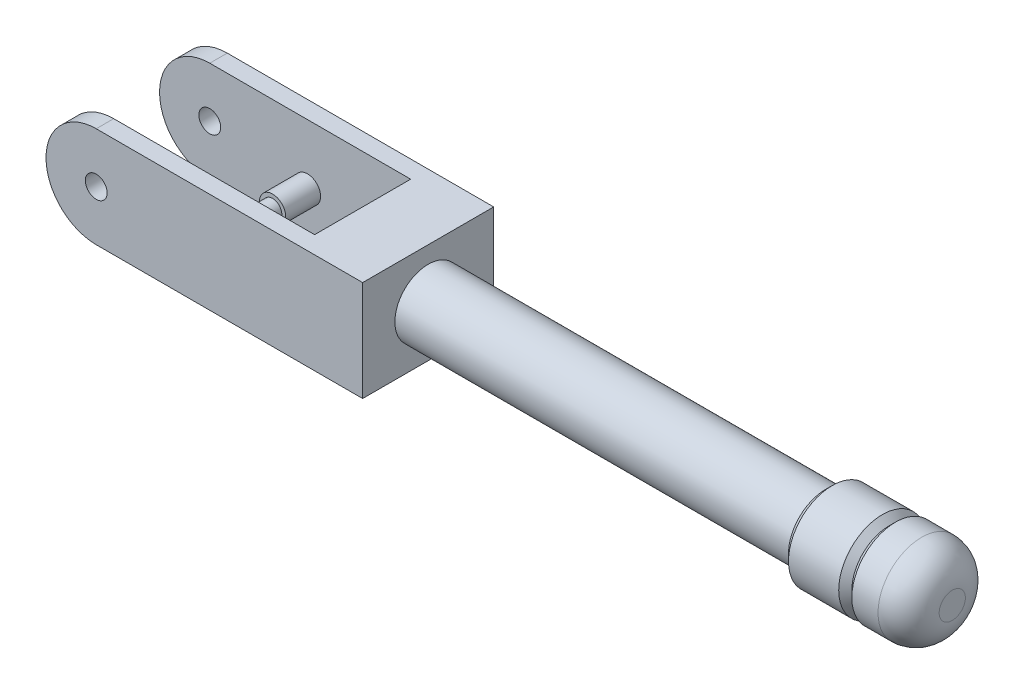
ISO-10303-21;
HEADER;
FILE_DESCRIPTION(('STEP AP214'),'2;1');
FILE_NAME('part.step','',(''),(''),'','','');
FILE_SCHEMA(('AUTOMOTIVE_DESIGN { 1 0 10303 214 1 1 1 1 }'));
ENDSEC;
DATA;
#1=APPLICATION_CONTEXT('core data for automotive mechanical design processes');
#2=APPLICATION_PROTOCOL_DEFINITION('international standard','automotive_design',2000,#1);
#3=PRODUCT_CONTEXT('',#1,'mechanical');
#4=PRODUCT('Part','Part','',(#3));
#5=PRODUCT_RELATED_PRODUCT_CATEGORY('part','',(#4));
#6=PRODUCT_DEFINITION_FORMATION('','',#4);
#7=PRODUCT_DEFINITION_CONTEXT('part definition',#1,'design');
#8=PRODUCT_DEFINITION('design','',#6,#7);
#9=PRODUCT_DEFINITION_SHAPE('','',#8);
#10=(LENGTH_UNIT() NAMED_UNIT(*) SI_UNIT(.MILLI.,.METRE.));
#11=(NAMED_UNIT(*) PLANE_ANGLE_UNIT() SI_UNIT($,.RADIAN.));
#12=(NAMED_UNIT(*) SI_UNIT($,.STERADIAN.) SOLID_ANGLE_UNIT());
#13=UNCERTAINTY_MEASURE_WITH_UNIT(LENGTH_MEASURE(1.E-05),#10,'distance_accuracy_value','');
#14=(GEOMETRIC_REPRESENTATION_CONTEXT(3) GLOBAL_UNCERTAINTY_ASSIGNED_CONTEXT((#13)) GLOBAL_UNIT_ASSIGNED_CONTEXT((#10,
#11,#12)) REPRESENTATION_CONTEXT('',''));
#15=CARTESIAN_POINT('',(0.,0.,0.));
#16=DIRECTION('',(0.,0.,1.));
#17=DIRECTION('',(1.,0.,0.));
#18=AXIS2_PLACEMENT_3D('',#15,#16,#17);
#19=CARTESIAN_POINT('',(122.000008821044,-23.,-30.));
#20=DIRECTION('',(1.,0.,0.));
#21=DIRECTION('',(0.,0.,-1.));
#22=AXIS2_PLACEMENT_3D('',#19,#20,#21);
#23=PLANE('',#22);
#24=DIRECTION('',(0.,1.,0.));
#25=VECTOR('',#24,1.);
#26=CARTESIAN_POINT('',(122.000008821044,-23.,30.));
#27=LINE('',#26,#25);
#28=CARTESIAN_POINT('',(122.000008821044,-23.,30.));
#29=VERTEX_POINT('',#28);
#30=CARTESIAN_POINT('',(122.000008821044,22.9999999999961,30.));
#31=VERTEX_POINT('',#30);
#32=EDGE_CURVE('E291',#29,#31,#27,.T.);
#33=ORIENTED_EDGE('',*,*,#32,.F.);
#34=DIRECTION('',(0.,0.,1.));
#35=VECTOR('',#34,1.);
#36=CARTESIAN_POINT('',(122.000008821044,-23.,-30.));
#37=LINE('',#36,#35);
#38=CARTESIAN_POINT('',(122.000008821044,-23.,-30.));
#39=VERTEX_POINT('',#38);
#40=EDGE_CURVE('E91',#39,#29,#37,.T.);
#41=ORIENTED_EDGE('',*,*,#40,.F.);
#42=DIRECTION('',(0.,1.,0.));
#43=VECTOR('',#42,1.);
#44=CARTESIAN_POINT('',(122.000008821044,-23.,-30.));
#45=LINE('',#44,#43);
#46=CARTESIAN_POINT('',(122.000008821044,22.9999999999961,-30.));
#47=VERTEX_POINT('',#46);
#48=EDGE_CURVE('E299',#39,#47,#45,.T.);
#49=ORIENTED_EDGE('',*,*,#48,.T.);
#50=DIRECTION('',(0.,0.,1.));
#51=VECTOR('',#50,1.);
#52=CARTESIAN_POINT('',(122.000008821044,22.9999999999961,-30.));
#53=LINE('',#52,#51);
#54=EDGE_CURVE('E141',#47,#31,#53,.T.);
#55=ORIENTED_EDGE('',*,*,#54,.T.);
#56=EDGE_LOOP('',(#33,#41,#49,#55));
#57=FACE_BOUND('',#56,.T.);
#58=CARTESIAN_POINT('',(122.000008821044,-1.9671764217577E-12,0.));
#59=DIRECTION('',(1.,0.,0.));
#60=DIRECTION('',(0.,0.,-1.));
#61=AXIS2_PLACEMENT_3D('',#58,#59,#60);
#62=CIRCLE('',#61,15.25);
#63=CARTESIAN_POINT('',(122.000008821044,-1.9671764217577E-12,-15.25));
#64=VERTEX_POINT('',#63);
#65=EDGE_CURVE('E327',#64,#64,#62,.T.);
#66=ORIENTED_EDGE('',*,*,#65,.F.);
#67=EDGE_LOOP('',(#66));
#68=FACE_BOUND('',#67,.T.);
#69=ADVANCED_FACE('F37',(#57,#68),#23,.T.);
#70=CARTESIAN_POINT('',(92.0000088210424,-23.0010000000037,22.));
#71=DIRECTION('',(0.,0.,1.));
#72=DIRECTION('',(1.,0.,0.));
#73=AXIS2_PLACEMENT_3D('',#70,#71,#72);
#74=PLANE('',#73);
#75=CARTESIAN_POINT('',(0.,0.,22.));
#76=DIRECTION('',(0.,0.,1.));
#77=DIRECTION('',(1.,0.,0.));
#78=AXIS2_PLACEMENT_3D('',#75,#76,#77);
#79=CIRCLE('',#78,5.);
#80=CARTESIAN_POINT('',(5.,0.,22.));
#81=VERTEX_POINT('',#80);
#82=EDGE_CURVE('E330',#81,#81,#79,.T.);
#83=ORIENTED_EDGE('',*,*,#82,.T.);
#84=EDGE_LOOP('',(#83));
#85=FACE_BOUND('',#84,.T.);
#86=CARTESIAN_POINT('',(0.,0.,22.));
#87=DIRECTION('',(0.,0.,1.));
#88=DIRECTION('',(1.,0.,0.));
#89=AXIS2_PLACEMENT_3D('',#86,#87,#88);
#90=CIRCLE('',#89,23.);
#91=CARTESIAN_POINT('',(7.49400541621981E-13,23.,22.));
#92=VERTEX_POINT('',#91);
#93=CARTESIAN_POINT('',(0.,-23.,22.));
#94=VERTEX_POINT('',#93);
#95=EDGE_CURVE('E130',#92,#94,#90,.T.);
#96=ORIENTED_EDGE('',*,*,#95,.F.);
#97=DIRECTION('',(1.,0.,0.));
#98=VECTOR('',#97,1.);
#99=CARTESIAN_POINT('',(92.0000088210439,22.999999999997,22.));
#100=LINE('',#99,#98);
#101=CARTESIAN_POINT('',(92.0000088210439,22.999999999997,22.));
#102=VERTEX_POINT('',#101);
#103=EDGE_CURVE('E123',#92,#102,#100,.T.);
#104=ORIENTED_EDGE('',*,*,#103,.T.);
#105=DIRECTION('',(0.,1.,0.));
#106=VECTOR('',#105,1.);
#107=CARTESIAN_POINT('',(92.0000088210424,-23.0010000000037,22.));
#108=LINE('',#107,#106);
#109=CARTESIAN_POINT('',(92.0000088210424,-23.,22.));
#110=VERTEX_POINT('',#109);
#111=EDGE_CURVE('E308',#110,#102,#108,.T.);
#112=ORIENTED_EDGE('',*,*,#111,.F.);
#113=DIRECTION('',(1.,0.,0.));
#114=VECTOR('',#113,1.);
#115=CARTESIAN_POINT('',(92.0000088210424,-23.,22.));
#116=LINE('',#115,#114);
#117=EDGE_CURVE('E285',#94,#110,#116,.T.);
#118=ORIENTED_EDGE('',*,*,#117,.F.);
#119=EDGE_LOOP('',(#96,#104,#112,#118));
#120=FACE_BOUND('',#119,.T.);
#121=CARTESIAN_POINT('',(44.7500088210439,-4.50000000000001,21.9999999999914));
#122=DIRECTION('',(0.,0.,1.));
#123=DIRECTION('',(1.,0.,0.));
#124=AXIS2_PLACEMENT_3D('',#121,#122,#123);
#125=CIRCLE('',#124,6.00000000000001);
#126=CARTESIAN_POINT('',(50.7500088210439,-4.50000000000001,21.9999999999914));
#127=VERTEX_POINT('',#126);
#128=EDGE_CURVE('E150',#127,#127,#125,.F.);
#129=ORIENTED_EDGE('',*,*,#128,.F.);
#130=EDGE_LOOP('',(#129));
#131=FACE_BOUND('',#130,.T.);
#132=ADVANCED_FACE('F186',(#85,#120,#131),#74,.F.);
#133=CARTESIAN_POINT('',(44.7500088210439,-4.50000000000001,-5.99999999999999));
#134=DIRECTION('',(0.,0.,1.));
#135=DIRECTION('',(1.,0.,0.));
#136=AXIS2_PLACEMENT_3D('',#133,#134,#135);
#137=PLANE('',#136);
#138=CARTESIAN_POINT('',(44.7500088210439,-4.50000000000001,-5.99999999999999));
#139=DIRECTION('',(0.,0.,1.));
#140=DIRECTION('',(1.,0.,0.));
#141=AXIS2_PLACEMENT_3D('',#138,#139,#140);
#142=CIRCLE('',#141,6.);
#143=CARTESIAN_POINT('',(50.7500088210439,-4.50000000000001,-5.99999999999999));
#144=VERTEX_POINT('',#143);
#145=EDGE_CURVE('E131',#144,#144,#142,.T.);
#146=ORIENTED_EDGE('',*,*,#145,.T.);
#147=EDGE_LOOP('',(#146));
#148=FACE_BOUND('',#147,.T.);
#149=CARTESIAN_POINT('',(44.7500088210439,-4.50000000000001,-5.99999999999999));
#150=DIRECTION('',(0.,0.,1.));
#151=DIRECTION('',(1.,0.,0.));
#152=AXIS2_PLACEMENT_3D('',#149,#150,#151);
#153=CIRCLE('',#152,4.25000000000001);
#154=CARTESIAN_POINT('',(49.0000088210439,-4.50000000000001,-5.99999999999999));
#155=VERTEX_POINT('',#154);
#156=EDGE_CURVE('E318',#155,#155,#153,.T.);
#157=ORIENTED_EDGE('',*,*,#156,.F.);
#158=EDGE_LOOP('',(#157));
#159=FACE_BOUND('',#158,.T.);
#160=ADVANCED_FACE('F191',(#148,#159),#137,.T.);
#161=CARTESIAN_POINT('',(92.0000088210424,-23.0010000000037,-22.));
#162=DIRECTION('',(0.,0.,-1.));
#163=DIRECTION('',(-1.,0.,0.));
#164=AXIS2_PLACEMENT_3D('',#161,#162,#163);
#165=PLANE('',#164);
#166=CARTESIAN_POINT('',(0.,0.,-22.));
#167=DIRECTION('',(0.,0.,-1.));
#168=DIRECTION('',(-1.,0.,0.));
#169=AXIS2_PLACEMENT_3D('',#166,#167,#168);
#170=CIRCLE('',#169,5.);
#171=CARTESIAN_POINT('',(-5.,0.,-22.));
#172=VERTEX_POINT('',#171);
#173=EDGE_CURVE('E335',#172,#172,#170,.T.);
#174=ORIENTED_EDGE('',*,*,#173,.T.);
#175=EDGE_LOOP('',(#174));
#176=FACE_BOUND('',#175,.T.);
#177=DIRECTION('',(0.,1.,0.));
#178=VECTOR('',#177,1.);
#179=CARTESIAN_POINT('',(92.0000088210424,-23.0010000000037,-22.));
#180=LINE('',#179,#178);
#181=CARTESIAN_POINT('',(92.0000088210439,-23.,-22.));
#182=VERTEX_POINT('',#181);
#183=CARTESIAN_POINT('',(92.0000088210439,22.999999999997,-22.));
#184=VERTEX_POINT('',#183);
#185=EDGE_CURVE('E120',#182,#184,#180,.T.);
#186=ORIENTED_EDGE('',*,*,#185,.T.);
#187=DIRECTION('',(-1.,0.,0.));
#188=VECTOR('',#187,1.);
#189=CARTESIAN_POINT('',(92.0000088210439,22.999999999997,-22.));
#190=LINE('',#189,#188);
#191=CARTESIAN_POINT('',(0.,23.,-22.));
#192=VERTEX_POINT('',#191);
#193=EDGE_CURVE('E115',#184,#192,#190,.T.);
#194=ORIENTED_EDGE('',*,*,#193,.T.);
#195=CARTESIAN_POINT('',(0.,0.,-22.));
#196=DIRECTION('',(0.,0.,-1.));
#197=DIRECTION('',(-1.,0.,0.));
#198=AXIS2_PLACEMENT_3D('',#195,#196,#197);
#199=CIRCLE('',#198,23.);
#200=CARTESIAN_POINT('',(0.,-23.,-22.));
#201=VERTEX_POINT('',#200);
#202=EDGE_CURVE('E119',#201,#192,#199,.T.);
#203=ORIENTED_EDGE('',*,*,#202,.F.);
#204=DIRECTION('',(-1.,0.,0.));
#205=VECTOR('',#204,1.);
#206=CARTESIAN_POINT('',(92.0000088210424,-23.,-22.));
#207=LINE('',#206,#205);
#208=EDGE_CURVE('E292',#182,#201,#207,.T.);
#209=ORIENTED_EDGE('',*,*,#208,.F.);
#210=EDGE_LOOP('',(#186,#194,#203,#209));
#211=FACE_BOUND('',#210,.T.);
#212=CARTESIAN_POINT('',(44.7500088210439,-4.50000000000001,-22.));
#213=DIRECTION('',(0.,0.,-1.));
#214=DIRECTION('',(-1.,0.,0.));
#215=AXIS2_PLACEMENT_3D('',#212,#213,#214);
#216=CIRCLE('',#215,6.);
#217=CARTESIAN_POINT('',(38.7500088210439,-4.50000000000001,-22.));
#218=VERTEX_POINT('',#217);
#219=EDGE_CURVE('E147',#218,#218,#216,.F.);
#220=ORIENTED_EDGE('',*,*,#219,.F.);
#221=EDGE_LOOP('',(#220));
#222=FACE_BOUND('',#221,.T.);
#223=ADVANCED_FACE('F117',(#176,#211,#222),#165,.F.);
#224=CARTESIAN_POINT('',(0.,0.,-30.));
#225=DIRECTION('',(0.,0.,1.));
#226=DIRECTION('',(1.,0.,0.));
#227=AXIS2_PLACEMENT_3D('',#224,#225,#226);
#228=CYLINDRICAL_SURFACE('',#227,23.);
#229=ORIENTED_EDGE('',*,*,#95,.T.);
#230=DIRECTION('',(0.,0.,1.));
#231=VECTOR('',#230,1.);
#232=CARTESIAN_POINT('',(0.,-23.,-30.));
#233=LINE('',#232,#231);
#234=CARTESIAN_POINT('',(0.,-23.,30.));
#235=VERTEX_POINT('',#234);
#236=EDGE_CURVE('E84',#94,#235,#233,.T.);
#237=ORIENTED_EDGE('',*,*,#236,.T.);
#238=CARTESIAN_POINT('',(0.,0.,30.));
#239=DIRECTION('',(0.,0.,1.));
#240=DIRECTION('',(1.,0.,0.));
#241=AXIS2_PLACEMENT_3D('',#238,#239,#240);
#242=CIRCLE('',#241,23.);
#243=CARTESIAN_POINT('',(0.,23.,30.));
#244=VERTEX_POINT('',#243);
#245=EDGE_CURVE('E295',#244,#235,#242,.T.);
#246=ORIENTED_EDGE('',*,*,#245,.F.);
#247=DIRECTION('',(0.,0.,1.));
#248=VECTOR('',#247,1.);
#249=CARTESIAN_POINT('',(0.,23.,-30.));
#250=LINE('',#249,#248);
#251=EDGE_CURVE('E138',#92,#244,#250,.T.);
#252=ORIENTED_EDGE('',*,*,#251,.F.);
#253=EDGE_LOOP('',(#229,#237,#246,#252));
#254=FACE_BOUND('',#253,.T.);
#255=ADVANCED_FACE('F201',(#254),#228,.T.);
#256=CARTESIAN_POINT('',(122.000008821044,-23.,-30.));
#257=DIRECTION('',(0.,-1.,0.));
#258=DIRECTION('',(0.,0.,-1.));
#259=AXIS2_PLACEMENT_3D('',#256,#257,#258);
#260=PLANE('',#259);
#261=ORIENTED_EDGE('',*,*,#117,.T.);
#262=DIRECTION('',(0.,0.,-1.));
#263=VECTOR('',#262,1.);
#264=CARTESIAN_POINT('',(92.0000088210424,-23.,-22.));
#265=LINE('',#264,#263);
#266=EDGE_CURVE('E281',#110,#182,#265,.T.);
#267=ORIENTED_EDGE('',*,*,#266,.T.);
#268=ORIENTED_EDGE('',*,*,#208,.T.);
#269=CARTESIAN_POINT('',(0.,-23.,-30.));
#270=VERTEX_POINT('',#269);
#271=EDGE_CURVE('E61',#270,#201,#233,.T.);
#272=ORIENTED_EDGE('',*,*,#271,.F.);
#273=DIRECTION('',(1.,0.,0.));
#274=VECTOR('',#273,1.);
#275=CARTESIAN_POINT('',(122.000008821044,-23.,-30.));
#276=LINE('',#275,#274);
#277=EDGE_CURVE('E298',#270,#39,#276,.T.);
#278=ORIENTED_EDGE('',*,*,#277,.T.);
#279=ORIENTED_EDGE('',*,*,#40,.T.);
#280=DIRECTION('',(1.,0.,0.));
#281=VECTOR('',#280,1.);
#282=CARTESIAN_POINT('',(122.000008821044,-23.,30.));
#283=LINE('',#282,#281);
#284=EDGE_CURVE('E287',#235,#29,#283,.T.);
#285=ORIENTED_EDGE('',*,*,#284,.F.);
#286=ORIENTED_EDGE('',*,*,#236,.F.);
#287=EDGE_LOOP('',(#261,#267,#268,#272,#278,#279,#285,#286));
#288=FACE_BOUND('',#287,.T.);
#289=ADVANCED_FACE('F198',(#288),#260,.T.);
#290=ORIENTED_EDGE('',*,*,#202,.T.);
#291=CARTESIAN_POINT('',(0.,23.,-30.));
#292=VERTEX_POINT('',#291);
#293=EDGE_CURVE('E128',#292,#192,#250,.T.);
#294=ORIENTED_EDGE('',*,*,#293,.F.);
#295=CARTESIAN_POINT('',(0.,0.,-30.));
#296=DIRECTION('',(0.,0.,1.));
#297=DIRECTION('',(1.,0.,0.));
#298=AXIS2_PLACEMENT_3D('',#295,#296,#297);
#299=CIRCLE('',#298,23.);
#300=EDGE_CURVE('E146',#292,#270,#299,.T.);
#301=ORIENTED_EDGE('',*,*,#300,.T.);
#302=ORIENTED_EDGE('',*,*,#271,.T.);
#303=EDGE_LOOP('',(#290,#294,#301,#302));
#304=FACE_BOUND('',#303,.T.);
#305=ADVANCED_FACE('F126',(#304),#228,.T.);
#306=CARTESIAN_POINT('',(0.,23.,-30.));
#307=DIRECTION('',(0.,1.,0.));
#308=DIRECTION('',(-1.,0.,0.));
#309=AXIS2_PLACEMENT_3D('',#306,#307,#308);
#310=PLANE('',#309);
#311=ORIENTED_EDGE('',*,*,#103,.F.);
#312=ORIENTED_EDGE('',*,*,#251,.T.);
#313=DIRECTION('',(-1.,0.,0.));
#314=VECTOR('',#313,1.);
#315=CARTESIAN_POINT('',(0.,23.,30.));
#316=LINE('',#315,#314);
#317=EDGE_CURVE('E297',#31,#244,#316,.T.);
#318=ORIENTED_EDGE('',*,*,#317,.F.);
#319=ORIENTED_EDGE('',*,*,#54,.F.);
#320=DIRECTION('',(-1.,0.,0.));
#321=VECTOR('',#320,1.);
#322=CARTESIAN_POINT('',(0.,23.,-30.));
#323=LINE('',#322,#321);
#324=EDGE_CURVE('E136',#47,#292,#323,.T.);
#325=ORIENTED_EDGE('',*,*,#324,.T.);
#326=ORIENTED_EDGE('',*,*,#293,.T.);
#327=ORIENTED_EDGE('',*,*,#193,.F.);
#328=DIRECTION('',(0.,0.,-1.));
#329=VECTOR('',#328,1.);
#330=CARTESIAN_POINT('',(92.0000088210439,22.999999999997,-22.));
#331=LINE('',#330,#329);
#332=EDGE_CURVE('E52',#102,#184,#331,.T.);
#333=ORIENTED_EDGE('',*,*,#332,.F.);
#334=EDGE_LOOP('',(#311,#312,#318,#319,#325,#326,#327,#333));
#335=FACE_BOUND('',#334,.T.);
#336=ADVANCED_FACE('F134',(#335),#310,.T.);
#337=CARTESIAN_POINT('',(0.,0.,-30.));
#338=DIRECTION('',(0.,0.,1.));
#339=DIRECTION('',(1.,0.,0.));
#340=AXIS2_PLACEMENT_3D('',#337,#338,#339);
#341=PLANE('',#340);
#342=CARTESIAN_POINT('',(0.,0.,-30.));
#343=DIRECTION('',(0.,0.,1.));
#344=DIRECTION('',(1.,0.,0.));
#345=AXIS2_PLACEMENT_3D('',#342,#343,#344);
#346=CIRCLE('',#345,5.);
#347=CARTESIAN_POINT('',(5.,0.,-30.));
#348=VERTEX_POINT('',#347);
#349=EDGE_CURVE('E338',#348,#348,#346,.T.);
#350=ORIENTED_EDGE('',*,*,#349,.T.);
#351=EDGE_LOOP('',(#350));
#352=FACE_BOUND('',#351,.T.);
#353=ORIENTED_EDGE('',*,*,#277,.F.);
#354=ORIENTED_EDGE('',*,*,#300,.F.);
#355=ORIENTED_EDGE('',*,*,#324,.F.);
#356=ORIENTED_EDGE('',*,*,#48,.F.);
#357=EDGE_LOOP('',(#353,#354,#355,#356));
#358=FACE_BOUND('',#357,.T.);
#359=ADVANCED_FACE('F265',(#352,#358),#341,.F.);
#360=CARTESIAN_POINT('',(0.,0.,30.));
#361=DIRECTION('',(0.,0.,1.));
#362=DIRECTION('',(1.,0.,0.));
#363=AXIS2_PLACEMENT_3D('',#360,#361,#362);
#364=PLANE('',#363);
#365=CARTESIAN_POINT('',(0.,0.,30.));
#366=DIRECTION('',(0.,0.,1.));
#367=DIRECTION('',(1.,0.,0.));
#368=AXIS2_PLACEMENT_3D('',#365,#366,#367);
#369=CIRCLE('',#368,5.);
#370=CARTESIAN_POINT('',(5.,0.,30.));
#371=VERTEX_POINT('',#370);
#372=EDGE_CURVE('E339',#371,#371,#369,.T.);
#373=ORIENTED_EDGE('',*,*,#372,.F.);
#374=EDGE_LOOP('',(#373));
#375=FACE_BOUND('',#374,.T.);
#376=ORIENTED_EDGE('',*,*,#284,.T.);
#377=ORIENTED_EDGE('',*,*,#32,.T.);
#378=ORIENTED_EDGE('',*,*,#317,.T.);
#379=ORIENTED_EDGE('',*,*,#245,.T.);
#380=EDGE_LOOP('',(#376,#377,#378,#379));
#381=FACE_BOUND('',#380,.T.);
#382=ADVANCED_FACE('F264',(#375,#381),#364,.T.);
#383=CARTESIAN_POINT('',(92.0000088210424,-23.0010000000037,-22.));
#384=DIRECTION('',(1.,0.,0.));
#385=DIRECTION('',(0.,1.,0.));
#386=AXIS2_PLACEMENT_3D('',#383,#384,#385);
#387=PLANE('',#386);
#388=ORIENTED_EDGE('',*,*,#111,.T.);
#389=ORIENTED_EDGE('',*,*,#332,.T.);
#390=ORIENTED_EDGE('',*,*,#185,.F.);
#391=ORIENTED_EDGE('',*,*,#266,.F.);
#392=EDGE_LOOP('',(#388,#389,#390,#391));
#393=FACE_BOUND('',#392,.T.);
#394=ADVANCED_FACE('F256',(#393),#387,.F.);
#395=CARTESIAN_POINT('',(44.7500088210439,-4.50000000000001,-5.99999999999999));
#396=DIRECTION('',(0.,0.,-1.));
#397=DIRECTION('',(-1.,0.,0.));
#398=AXIS2_PLACEMENT_3D('',#395,#396,#397);
#399=CYLINDRICAL_SURFACE('',#398,6.);
#400=ORIENTED_EDGE('',*,*,#145,.F.);
#401=EDGE_LOOP('',(#400));
#402=FACE_BOUND('',#401,.T.);
#403=ORIENTED_EDGE('',*,*,#219,.T.);
#404=EDGE_LOOP('',(#403));
#405=FACE_BOUND('',#404,.T.);
#406=ADVANCED_FACE('F250',(#402,#405),#399,.T.);
#407=CARTESIAN_POINT('',(44.7500088210439,-4.50000000000001,6.00000000000001));
#408=DIRECTION('',(0.,0.,-1.));
#409=DIRECTION('',(-1.,0.,0.));
#410=AXIS2_PLACEMENT_3D('',#407,#408,#409);
#411=CYLINDRICAL_SURFACE('',#410,4.25000000000001);
#412=CARTESIAN_POINT('',(44.7500088210439,-4.50000000000001,6.00000000000001));
#413=DIRECTION('',(0.,0.,1.));
#414=DIRECTION('',(1.,0.,0.));
#415=AXIS2_PLACEMENT_3D('',#412,#413,#414);
#416=CIRCLE('',#415,4.25000000000001);
#417=CARTESIAN_POINT('',(49.0000088210439,-4.50000000000001,6.00000000000001));
#418=VERTEX_POINT('',#417);
#419=EDGE_CURVE('E317',#418,#418,#416,.T.);
#420=ORIENTED_EDGE('',*,*,#419,.F.);
#421=EDGE_LOOP('',(#420));
#422=FACE_BOUND('',#421,.T.);
#423=ORIENTED_EDGE('',*,*,#156,.T.);
#424=EDGE_LOOP('',(#423));
#425=FACE_BOUND('',#424,.T.);
#426=ADVANCED_FACE('F243',(#422,#425),#411,.T.);
#427=CARTESIAN_POINT('',(44.7500088210439,-4.50000000000001,6.00000000000001));
#428=DIRECTION('',(0.,0.,1.));
#429=DIRECTION('',(1.,0.,0.));
#430=AXIS2_PLACEMENT_3D('',#427,#428,#429);
#431=PLANE('',#430);
#432=CARTESIAN_POINT('',(44.7500088210439,-4.50000000000001,6.00000000000001));
#433=DIRECTION('',(0.,0.,1.));
#434=DIRECTION('',(1.,0.,0.));
#435=AXIS2_PLACEMENT_3D('',#432,#433,#434);
#436=CIRCLE('',#435,6.00000000000001);
#437=CARTESIAN_POINT('',(50.7500088210439,-4.50000000000001,6.00000000000001));
#438=VERTEX_POINT('',#437);
#439=EDGE_CURVE('E321',#438,#438,#436,.T.);
#440=ORIENTED_EDGE('',*,*,#439,.F.);
#441=EDGE_LOOP('',(#440));
#442=FACE_BOUND('',#441,.T.);
#443=ORIENTED_EDGE('',*,*,#419,.T.);
#444=EDGE_LOOP('',(#443));
#445=FACE_BOUND('',#444,.T.);
#446=ADVANCED_FACE('F240',(#442,#445),#431,.F.);
#447=CARTESIAN_POINT('',(44.7500088210439,-4.50000000000001,500000.));
#448=DIRECTION('',(0.,0.,-1.));
#449=DIRECTION('',(-1.,0.,0.));
#450=AXIS2_PLACEMENT_3D('',#447,#448,#449);
#451=CYLINDRICAL_SURFACE('',#450,6.00000000000001);
#452=ORIENTED_EDGE('',*,*,#439,.T.);
#453=EDGE_LOOP('',(#452));
#454=FACE_BOUND('',#453,.T.);
#455=ORIENTED_EDGE('',*,*,#128,.T.);
#456=EDGE_LOOP('',(#455));
#457=FACE_BOUND('',#456,.T.);
#458=ADVANCED_FACE('F238',(#454,#457),#451,.T.);
#459=CARTESIAN_POINT('',(304.000008821044,-1.9671764217577E-12,0.));
#460=DIRECTION('',(-1.,0.,0.));
#461=DIRECTION('',(0.,0.,1.));
#462=AXIS2_PLACEMENT_3D('',#459,#460,#461);
#463=CYLINDRICAL_SURFACE('',#462,15.25);
#464=CARTESIAN_POINT('',(304.000008821044,-1.9671764217577E-12,0.));
#465=DIRECTION('',(1.,0.,0.));
#466=DIRECTION('',(0.,0.,-1.));
#467=AXIS2_PLACEMENT_3D('',#464,#465,#466);
#468=CIRCLE('',#467,15.25);
#469=CARTESIAN_POINT('',(304.000008821044,-1.9671764217577E-12,-15.25));
#470=VERTEX_POINT('',#469);
#471=EDGE_CURVE('E326',#470,#470,#468,.T.);
#472=ORIENTED_EDGE('',*,*,#471,.F.);
#473=EDGE_LOOP('',(#472));
#474=FACE_BOUND('',#473,.T.);
#475=ORIENTED_EDGE('',*,*,#65,.T.);
#476=EDGE_LOOP('',(#475));
#477=FACE_BOUND('',#476,.T.);
#478=ADVANCED_FACE('F232',(#474,#477),#463,.T.);
#479=CARTESIAN_POINT('',(304.000008821044,-1.9671764217577E-12,0.));
#480=DIRECTION('',(1.,0.,0.));
#481=DIRECTION('',(0.,0.,-1.));
#482=AXIS2_PLACEMENT_3D('',#479,#480,#481);
#483=PLANE('',#482);
#484=CARTESIAN_POINT('',(304.000008821044,-1.9671764217577E-12,0.));
#485=DIRECTION('',(1.,0.,0.));
#486=DIRECTION('',(0.,0.,-1.));
#487=AXIS2_PLACEMENT_3D('',#484,#485,#486);
#488=CIRCLE('',#487,16.9999999999998);
#489=CARTESIAN_POINT('',(304.000008821044,-1.9671764217577E-12,-16.9999999999998));
#490=VERTEX_POINT('',#489);
#491=EDGE_CURVE('E156',#490,#490,#488,.F.);
#492=ORIENTED_EDGE('',*,*,#491,.T.);
#493=EDGE_LOOP('',(#492));
#494=FACE_BOUND('',#493,.T.);
#495=ORIENTED_EDGE('',*,*,#471,.T.);
#496=EDGE_LOOP('',(#495));
#497=FACE_BOUND('',#496,.T.);
#498=ADVANCED_FACE('F225',(#494,#497),#483,.F.);
#499=CARTESIAN_POINT('',(333.000008821044,-1.9671764217577E-12,0.));
#500=DIRECTION('',(-1.,0.,0.));
#501=DIRECTION('',(0.,0.,1.));
#502=AXIS2_PLACEMENT_3D('',#499,#500,#501);
#503=CYLINDRICAL_SURFACE('',#502,20.);
#504=CARTESIAN_POINT('',(330.000008821044,-1.9671764217577E-12,0.));
#505=DIRECTION('',(1.,0.,0.));
#506=DIRECTION('',(0.,0.,-1.));
#507=AXIS2_PLACEMENT_3D('',#504,#505,#506);
#508=CIRCLE('',#507,20.);
#509=CARTESIAN_POINT('',(330.000008821044,-1.9671764217577E-12,20.));
#510=VERTEX_POINT('',#509);
#511=EDGE_CURVE('E162',#510,#510,#508,.F.);
#512=CARTESIAN_POINT('',(307.000008821044,-1.9671764217577E-12,0.));
#513=DIRECTION('',(1.,0.,0.));
#514=DIRECTION('',(0.,0.,-1.));
#515=AXIS2_PLACEMENT_3D('',#512,#513,#514);
#516=CIRCLE('',#515,20.);
#517=CARTESIAN_POINT('',(307.000008821044,-1.9671764217577E-12,20.));
#518=VERTEX_POINT('',#517);
#519=EDGE_CURVE('E153',#518,#518,#516,.T.);
#520=CARTESIAN_POINT('',(330.000008821044,-1.9671764217577E-12,20.));
#521=CARTESIAN_POINT('',(329.760425487711,-1.9671764217577E-12,20.));
#522=CARTESIAN_POINT('',(329.520842154377,-1.9671764217577E-12,20.));
#523=CARTESIAN_POINT('',(329.041675487711,-1.9671764217577E-12,20.));
#524=CARTESIAN_POINT('',(328.802092154377,-1.9671764217577E-12,20.));
#525=CARTESIAN_POINT('',(328.322925487711,-1.9671764217577E-12,20.));
#526=CARTESIAN_POINT('',(328.083342154377,-1.9671764217577E-12,20.));
#527=CARTESIAN_POINT('',(327.604175487711,-1.9671764217577E-12,20.));
#528=CARTESIAN_POINT('',(327.364592154377,-1.9671764217577E-12,20.));
#529=CARTESIAN_POINT('',(326.885425487711,-1.9671764217577E-12,20.));
#530=CARTESIAN_POINT('',(326.645842154377,-1.9671764217577E-12,20.));
#531=CARTESIAN_POINT('',(326.166675487711,-1.9671764217577E-12,20.));
#532=CARTESIAN_POINT('',(325.927092154377,-1.9671764217577E-12,20.));
#533=CARTESIAN_POINT('',(325.447925487711,-1.9671764217577E-12,20.));
#534=CARTESIAN_POINT('',(325.208342154377,-1.9671764217577E-12,20.));
#535=CARTESIAN_POINT('',(324.729175487711,-1.9671764217577E-12,20.));
#536=CARTESIAN_POINT('',(324.489592154377,-1.9671764217577E-12,20.));
#537=CARTESIAN_POINT('',(324.010425487711,-1.9671764217577E-12,20.));
#538=CARTESIAN_POINT('',(323.770842154377,-1.9671764217577E-12,20.));
#539=CARTESIAN_POINT('',(323.291675487711,-1.9671764217577E-12,20.));
#540=CARTESIAN_POINT('',(323.052092154377,-1.9671764217577E-12,20.));
#541=CARTESIAN_POINT('',(322.572925487711,-1.9671764217577E-12,20.));
#542=CARTESIAN_POINT('',(322.333342154377,-1.9671764217577E-12,20.));
#543=CARTESIAN_POINT('',(321.854175487711,-1.9671764217577E-12,20.));
#544=CARTESIAN_POINT('',(321.614592154377,-1.9671764217577E-12,20.));
#545=CARTESIAN_POINT('',(321.135425487711,-1.9671764217577E-12,20.));
#546=CARTESIAN_POINT('',(320.895842154377,-1.9671764217577E-12,20.));
#547=CARTESIAN_POINT('',(320.416675487711,-1.9671764217577E-12,20.));
#548=CARTESIAN_POINT('',(320.177092154377,-1.9671764217577E-12,20.));
#549=CARTESIAN_POINT('',(319.697925487711,-1.9671764217577E-12,20.));
#550=CARTESIAN_POINT('',(319.458342154377,-1.9671764217577E-12,20.));
#551=CARTESIAN_POINT('',(318.979175487711,-1.9671764217577E-12,20.));
#552=CARTESIAN_POINT('',(318.739592154377,-1.9671764217577E-12,20.));
#553=CARTESIAN_POINT('',(318.260425487711,-1.9671764217577E-12,20.));
#554=CARTESIAN_POINT('',(318.020842154377,-1.9671764217577E-12,20.));
#555=CARTESIAN_POINT('',(317.541675487711,-1.9671764217577E-12,20.));
#556=CARTESIAN_POINT('',(317.302092154377,-1.9671764217577E-12,20.));
#557=CARTESIAN_POINT('',(316.822925487711,-1.9671764217577E-12,20.));
#558=CARTESIAN_POINT('',(316.583342154377,-1.9671764217577E-12,20.));
#559=CARTESIAN_POINT('',(316.104175487711,-1.9671764217577E-12,20.));
#560=CARTESIAN_POINT('',(315.864592154377,-1.9671764217577E-12,20.));
#561=CARTESIAN_POINT('',(315.385425487711,-1.9671764217577E-12,20.));
#562=CARTESIAN_POINT('',(315.145842154377,-1.9671764217577E-12,20.));
#563=CARTESIAN_POINT('',(314.666675487711,-1.9671764217577E-12,20.));
#564=CARTESIAN_POINT('',(314.427092154377,-1.9671764217577E-12,20.));
#565=CARTESIAN_POINT('',(313.947925487711,-1.9671764217577E-12,20.));
#566=CARTESIAN_POINT('',(313.708342154377,-1.9671764217577E-12,20.));
#567=CARTESIAN_POINT('',(313.229175487711,-1.9671764217577E-12,20.));
#568=CARTESIAN_POINT('',(312.989592154377,-1.9671764217577E-12,20.));
#569=CARTESIAN_POINT('',(312.510425487711,-1.9671764217577E-12,20.));
#570=CARTESIAN_POINT('',(312.270842154377,-1.9671764217577E-12,20.));
#571=CARTESIAN_POINT('',(311.791675487711,-1.9671764217577E-12,20.));
#572=CARTESIAN_POINT('',(311.552092154377,-1.9671764217577E-12,20.));
#573=CARTESIAN_POINT('',(311.072925487711,-1.9671764217577E-12,20.));
#574=CARTESIAN_POINT('',(310.833342154377,-1.9671764217577E-12,20.));
#575=CARTESIAN_POINT('',(310.354175487711,-1.9671764217577E-12,20.));
#576=CARTESIAN_POINT('',(310.114592154377,-1.9671764217577E-12,20.));
#577=CARTESIAN_POINT('',(309.635425487711,-1.9671764217577E-12,20.));
#578=CARTESIAN_POINT('',(309.395842154377,-1.9671764217577E-12,20.));
#579=CARTESIAN_POINT('',(308.916675487711,-1.9671764217577E-12,20.));
#580=CARTESIAN_POINT('',(308.677092154377,-1.9671764217577E-12,20.));
#581=CARTESIAN_POINT('',(308.197925487711,-1.9671764217577E-12,20.));
#582=CARTESIAN_POINT('',(307.958342154377,-1.9671764217577E-12,20.));
#583=CARTESIAN_POINT('',(307.479175487711,-1.9671764217577E-12,20.));
#584=CARTESIAN_POINT('',(307.239592154377,-1.9671764217577E-12,20.));
#585=CARTESIAN_POINT('',(307.000008821044,-1.9671764217577E-12,20.));
#586=B_SPLINE_CURVE_WITH_KNOTS('',3,(#520,#521,#522,#523,#524,#525,#526,#527,#528,#529,#530,
#531,#532,#533,#534,#535,#536,#537,#538,#539,#540,#541,#542,#543,#544,#545,#546,#547,#548,#549,
#550,#551,#552,#553,#554,#555,#556,#557,#558,#559,#560,#561,#562,#563,#564,#565,#566,#567,#568,
#569,#570,#571,#572,#573,#574,#575,#576,#577,#578,#579,#580,#581,#582,#583,#584,#585),
.UNSPECIFIED.,.F.,.F.,(4,2,2,2,2,2,2,2,2,2,2,2,2,2,2,2,2,2,2,2,2,2,2,2,2,2,2,2,2,2,2,2,4),(0.,
0.71874999999999,1.43749999999998,2.15624999999997,2.87499999999996,3.59374999999995,
4.31249999999994,5.03124999999999,5.74999999999998,6.46874999999997,7.18749999999996,
7.90624999999995,8.62499999999994,9.34374999999998,10.0625,10.78125,11.5,12.2187499999999,
12.9374999999999,13.6562499999999,14.375,15.09375,15.8125,16.5312499999999,17.2499999999999,
17.9687499999999,18.6874999999999,19.40625,20.125,20.8437499999999,21.5624999999999,
22.2812499999999,22.9999999999999),.UNSPECIFIED.);
#587=EDGE_CURVE('BSEAM206',#510,#518,#586,.T.);
#588=ORIENTED_EDGE('',*,*,#511,.T.);
#589=ORIENTED_EDGE('',*,*,#519,.T.);
#590=ORIENTED_EDGE('',*,*,#587,.T.);
#591=ORIENTED_EDGE('',*,*,#587,.F.);
#592=EDGE_LOOP('',(#588,#590,#589,#591));
#593=FACE_BOUND('',#592,.T.);
#594=ADVANCED_FACE('F206',(#593),#503,.T.);
#595=CARTESIAN_POINT('',(307.000008821044,-1.9671764217577E-12,0.));
#596=DIRECTION('',(1.,0.,0.));
#597=DIRECTION('',(0.,0.,-1.));
#598=AXIS2_PLACEMENT_3D('',#595,#596,#597);
#599=CONICAL_SURFACE('',#598,20.,0.785398163397441);
#600=ORIENTED_EDGE('',*,*,#491,.F.);
#601=EDGE_LOOP('',(#600));
#602=FACE_BOUND('',#601,.T.);
#603=ORIENTED_EDGE('',*,*,#519,.F.);
#604=EDGE_LOOP('',(#603));
#605=FACE_BOUND('',#604,.T.);
#606=ADVANCED_FACE('F202',(#602,#605),#599,.T.);
#607=CARTESIAN_POINT('',(333.000008821044,-1.9671764217577E-12,0.));
#608=DIRECTION('',(-1.,0.,0.));
#609=DIRECTION('',(0.,0.,1.));
#610=AXIS2_PLACEMENT_3D('',#607,#608,#609);
#611=CONICAL_SURFACE('',#610,17.0000000000002,0.785398163397446);
#612=ORIENTED_EDGE('',*,*,#511,.F.);
#613=EDGE_LOOP('',(#612));
#614=FACE_BOUND('',#613,.T.);
#615=CARTESIAN_POINT('',(333.000008821044,-1.9671764217577E-12,0.));
#616=DIRECTION('',(1.,0.,0.));
#617=DIRECTION('',(0.,0.,-1.));
#618=AXIS2_PLACEMENT_3D('',#615,#616,#617);
#619=CIRCLE('',#618,17.0000000000002);
#620=CARTESIAN_POINT('',(333.000008821044,-1.9671764217577E-12,-17.0000000000002));
#621=VERTEX_POINT('',#620);
#622=EDGE_CURVE('E159',#621,#621,#619,.T.);
#623=ORIENTED_EDGE('',*,*,#622,.F.);
#624=EDGE_LOOP('',(#623));
#625=FACE_BOUND('',#624,.T.);
#626=ADVANCED_FACE('F205',(#614,#625),#611,.T.);
#627=CARTESIAN_POINT('',(362.000008821044,-1.9671764217577E-12,0.));
#628=DIRECTION('',(-1.,0.,0.));
#629=DIRECTION('',(0.,0.,1.));
#630=AXIS2_PLACEMENT_3D('',#627,#628,#629);
#631=CYLINDRICAL_SURFACE('',#630,20.);
#632=CARTESIAN_POINT('',(348.000008821044,-1.9671764217577E-12,0.));
#633=DIRECTION('',(1.,0.,0.));
#634=DIRECTION('',(0.,0.,-1.));
#635=AXIS2_PLACEMENT_3D('',#632,#633,#634);
#636=CIRCLE('',#635,20.);
#637=CARTESIAN_POINT('',(348.000008821044,-1.9671764217577E-12,20.));
#638=VERTEX_POINT('',#637);
#639=EDGE_CURVE('E11',#638,#638,#636,.F.);
#640=CARTESIAN_POINT('',(336.000008821044,-1.9671764217577E-12,0.));
#641=DIRECTION('',(1.,0.,0.));
#642=DIRECTION('',(0.,0.,-1.));
#643=AXIS2_PLACEMENT_3D('',#640,#641,#642);
#644=CIRCLE('',#643,20.);
#645=CARTESIAN_POINT('',(336.000008821044,-1.9671764217577E-12,20.));
#646=VERTEX_POINT('',#645);
#647=EDGE_CURVE('E165',#646,#646,#644,.T.);
#648=CARTESIAN_POINT('',(348.000008821044,-1.9671764217577E-12,20.));
#649=CARTESIAN_POINT('',(347.875008821044,-1.9671764217577E-12,20.));
#650=CARTESIAN_POINT('',(347.750008821044,-1.9671764217577E-12,20.));
#651=CARTESIAN_POINT('',(347.500008821044,-1.9671764217577E-12,20.));
#652=CARTESIAN_POINT('',(347.375008821044,-1.9671764217577E-12,20.));
#653=CARTESIAN_POINT('',(347.125008821044,-1.9671764217577E-12,20.));
#654=CARTESIAN_POINT('',(347.000008821044,-1.9671764217577E-12,20.));
#655=CARTESIAN_POINT('',(346.750008821044,-1.9671764217577E-12,20.));
#656=CARTESIAN_POINT('',(346.625008821044,-1.9671764217577E-12,20.));
#657=CARTESIAN_POINT('',(346.375008821044,-1.9671764217577E-12,20.));
#658=CARTESIAN_POINT('',(346.250008821044,-1.9671764217577E-12,20.));
#659=CARTESIAN_POINT('',(346.000008821044,-1.9671764217577E-12,20.));
#660=CARTESIAN_POINT('',(345.875008821044,-1.9671764217577E-12,20.));
#661=CARTESIAN_POINT('',(345.625008821044,-1.9671764217577E-12,20.));
#662=CARTESIAN_POINT('',(345.500008821044,-1.9671764217577E-12,20.));
#663=CARTESIAN_POINT('',(345.250008821044,-1.9671764217577E-12,20.));
#664=CARTESIAN_POINT('',(345.125008821044,-1.9671764217577E-12,20.));
#665=CARTESIAN_POINT('',(344.875008821044,-1.9671764217577E-12,20.));
#666=CARTESIAN_POINT('',(344.750008821044,-1.9671764217577E-12,20.));
#667=CARTESIAN_POINT('',(344.500008821044,-1.9671764217577E-12,20.));
#668=CARTESIAN_POINT('',(344.375008821044,-1.9671764217577E-12,20.));
#669=CARTESIAN_POINT('',(344.125008821044,-1.9671764217577E-12,20.));
#670=CARTESIAN_POINT('',(344.000008821044,-1.9671764217577E-12,20.));
#671=CARTESIAN_POINT('',(343.750008821044,-1.9671764217577E-12,20.));
#672=CARTESIAN_POINT('',(343.625008821044,-1.9671764217577E-12,20.));
#673=CARTESIAN_POINT('',(343.375008821044,-1.9671764217577E-12,20.));
#674=CARTESIAN_POINT('',(343.250008821044,-1.9671764217577E-12,20.));
#675=CARTESIAN_POINT('',(343.000008821044,-1.9671764217577E-12,20.));
#676=CARTESIAN_POINT('',(342.875008821044,-1.9671764217577E-12,20.));
#677=CARTESIAN_POINT('',(342.625008821044,-1.9671764217577E-12,20.));
#678=CARTESIAN_POINT('',(342.500008821044,-1.9671764217577E-12,20.));
#679=CARTESIAN_POINT('',(342.250008821044,-1.9671764217577E-12,20.));
#680=CARTESIAN_POINT('',(342.125008821044,-1.9671764217577E-12,20.));
#681=CARTESIAN_POINT('',(341.875008821044,-1.9671764217577E-12,20.));
#682=CARTESIAN_POINT('',(341.750008821044,-1.9671764217577E-12,20.));
#683=CARTESIAN_POINT('',(341.500008821044,-1.9671764217577E-12,20.));
#684=CARTESIAN_POINT('',(341.375008821044,-1.9671764217577E-12,20.));
#685=CARTESIAN_POINT('',(341.125008821044,-1.9671764217577E-12,20.));
#686=CARTESIAN_POINT('',(341.000008821044,-1.9671764217577E-12,20.));
#687=CARTESIAN_POINT('',(340.750008821044,-1.9671764217577E-12,20.));
#688=CARTESIAN_POINT('',(340.625008821044,-1.9671764217577E-12,20.));
#689=CARTESIAN_POINT('',(340.375008821044,-1.9671764217577E-12,20.));
#690=CARTESIAN_POINT('',(340.250008821044,-1.9671764217577E-12,20.));
#691=CARTESIAN_POINT('',(340.000008821044,-1.9671764217577E-12,20.));
#692=CARTESIAN_POINT('',(339.875008821044,-1.9671764217577E-12,20.));
#693=CARTESIAN_POINT('',(339.625008821044,-1.9671764217577E-12,20.));
#694=CARTESIAN_POINT('',(339.500008821044,-1.9671764217577E-12,20.));
#695=CARTESIAN_POINT('',(339.250008821044,-1.9671764217577E-12,20.));
#696=CARTESIAN_POINT('',(339.125008821044,-1.9671764217577E-12,20.));
#697=CARTESIAN_POINT('',(338.875008821044,-1.9671764217577E-12,20.));
#698=CARTESIAN_POINT('',(338.750008821044,-1.9671764217577E-12,20.));
#699=CARTESIAN_POINT('',(338.500008821044,-1.9671764217577E-12,20.));
#700=CARTESIAN_POINT('',(338.375008821044,-1.9671764217577E-12,20.));
#701=CARTESIAN_POINT('',(338.125008821044,-1.9671764217577E-12,20.));
#702=CARTESIAN_POINT('',(338.000008821044,-1.9671764217577E-12,20.));
#703=CARTESIAN_POINT('',(337.750008821044,-1.9671764217577E-12,20.));
#704=CARTESIAN_POINT('',(337.625008821044,-1.9671764217577E-12,20.));
#705=CARTESIAN_POINT('',(337.375008821044,-1.9671764217577E-12,20.));
#706=CARTESIAN_POINT('',(337.250008821044,-1.9671764217577E-12,20.));
#707=CARTESIAN_POINT('',(337.000008821044,-1.9671764217577E-12,20.));
#708=CARTESIAN_POINT('',(336.875008821044,-1.9671764217577E-12,20.));
#709=CARTESIAN_POINT('',(336.625008821044,-1.9671764217577E-12,20.));
#710=CARTESIAN_POINT('',(336.500008821044,-1.9671764217577E-12,20.));
#711=CARTESIAN_POINT('',(336.250008821044,-1.9671764217577E-12,20.));
#712=CARTESIAN_POINT('',(336.125008821044,-1.9671764217577E-12,20.));
#713=CARTESIAN_POINT('',(336.000008821044,-1.9671764217577E-12,20.));
#714=B_SPLINE_CURVE_WITH_KNOTS('',3,(#648,#649,#650,#651,#652,#653,#654,#655,#656,#657,#658,
#659,#660,#661,#662,#663,#664,#665,#666,#667,#668,#669,#670,#671,#672,#673,#674,#675,#676,#677,
#678,#679,#680,#681,#682,#683,#684,#685,#686,#687,#688,#689,#690,#691,#692,#693,#694,#695,#696,
#697,#698,#699,#700,#701,#702,#703,#704,#705,#706,#707,#708,#709,#710,#711,#712,#713),
.UNSPECIFIED.,.F.,.F.,(4,2,2,2,2,2,2,2,2,2,2,2,2,2,2,2,2,2,2,2,2,2,2,2,2,2,2,2,2,2,2,2,4),(0.,
0.375000000000014,0.750000000000028,1.12499999999999,1.5,1.87500000000002,2.24999999999997,
2.62499999999999,3.,3.37499999999996,3.74999999999998,4.12499999999999,4.49999999999995,
4.87499999999996,5.24999999999998,5.62499999999994,5.99999999999995,6.37499999999996,
6.74999999999992,7.12499999999994,7.49999999999995,7.87499999999991,8.24999999999992,
8.62499999999994,8.9999999999999,9.37499999999991,9.74999999999993,10.1249999999999,
10.4999999999999,10.8749999999999,11.2499999999999,11.6249999999999,11.9999999999999),.UNSPECIFIED.);
#715=EDGE_CURVE('BSEAM209',#638,#646,#714,.T.);
#716=ORIENTED_EDGE('',*,*,#639,.T.);
#717=ORIENTED_EDGE('',*,*,#647,.T.);
#718=ORIENTED_EDGE('',*,*,#715,.T.);
#719=ORIENTED_EDGE('',*,*,#715,.F.);
#720=EDGE_LOOP('',(#716,#718,#717,#719));
#721=FACE_BOUND('',#720,.T.);
#722=ADVANCED_FACE('F209',(#721),#631,.T.);
#723=CARTESIAN_POINT('',(362.000008821044,-1.9671764217577E-12,0.));
#724=DIRECTION('',(1.,0.,0.));
#725=DIRECTION('',(0.,0.,-1.));
#726=AXIS2_PLACEMENT_3D('',#723,#724,#725);
#727=PLANE('',#726);
#728=CARTESIAN_POINT('',(362.000008821044,-1.9671764217577E-12,0.));
#729=DIRECTION('',(1.,0.,0.));
#730=DIRECTION('',(0.,0.,-1.));
#731=AXIS2_PLACEMENT_3D('',#728,#729,#730);
#732=CIRCLE('',#731,6.);
#733=CARTESIAN_POINT('',(362.000008821044,-1.9671764217577E-12,-6.));
#734=VERTEX_POINT('',#733);
#735=EDGE_CURVE('E45',#734,#734,#732,.T.);
#736=ORIENTED_EDGE('',*,*,#735,.T.);
#737=EDGE_LOOP('',(#736));
#738=FACE_BOUND('',#737,.T.);
#739=ADVANCED_FACE('F170',(#738),#727,.T.);
#740=CARTESIAN_POINT('',(336.000008821044,-1.9671764217577E-12,0.));
#741=DIRECTION('',(1.,0.,0.));
#742=DIRECTION('',(0.,0.,-1.));
#743=AXIS2_PLACEMENT_3D('',#740,#741,#742);
#744=CONICAL_SURFACE('',#743,20.,0.785398163397446);
#745=ORIENTED_EDGE('',*,*,#622,.T.);
#746=EDGE_LOOP('',(#745));
#747=FACE_BOUND('',#746,.T.);
#748=ORIENTED_EDGE('',*,*,#647,.F.);
#749=EDGE_LOOP('',(#748));
#750=FACE_BOUND('',#749,.T.);
#751=ADVANCED_FACE('F174',(#747,#750),#744,.T.);
#752=CARTESIAN_POINT('',(348.000008821044,-1.9671764217577E-12,0.));
#753=DIRECTION('',(1.,0.,0.));
#754=DIRECTION('',(0.,0.,-1.));
#755=AXIS2_PLACEMENT_3D('',#752,#753,#754);
#756=DEGENERATE_TOROIDAL_SURFACE('',#755,6.,14.,.T.);
#757=ORIENTED_EDGE('',*,*,#639,.F.);
#758=EDGE_LOOP('',(#757));
#759=FACE_BOUND('',#758,.T.);
#760=ORIENTED_EDGE('',*,*,#735,.F.);
#761=EDGE_LOOP('',(#760));
#762=FACE_BOUND('',#761,.T.);
#763=ADVANCED_FACE('F39',(#759,#762),#756,.T.);
#764=CARTESIAN_POINT('',(0.,0.,-30.));
#765=DIRECTION('',(0.,0.,1.));
#766=DIRECTION('',(1.,0.,0.));
#767=AXIS2_PLACEMENT_3D('',#764,#765,#766);
#768=CYLINDRICAL_SURFACE('',#767,5.);
#769=ORIENTED_EDGE('',*,*,#372,.T.);
#770=EDGE_LOOP('',(#769));
#771=FACE_BOUND('',#770,.T.);
#772=ORIENTED_EDGE('',*,*,#82,.F.);
#773=EDGE_LOOP('',(#772));
#774=FACE_BOUND('',#773,.T.);
#775=ADVANCED_FACE('F173',(#771,#774),#768,.F.);
#776=ORIENTED_EDGE('',*,*,#349,.F.);
#777=EDGE_LOOP('',(#776));
#778=FACE_BOUND('',#777,.T.);
#779=ORIENTED_EDGE('',*,*,#173,.F.);
#780=EDGE_LOOP('',(#779));
#781=FACE_BOUND('',#780,.T.);
#782=ADVANCED_FACE('F180',(#778,#781),#768,.F.);
#783=CLOSED_SHELL('',(#69,#132,#160,#223,#255,#289,#305,#336,#359,#382,#394,#406,#426,#446,#458,
#478,#498,#594,#606,#626,#722,#739,#751,#763,#775,#782));
#784=MANIFOLD_SOLID_BREP('B2',#783);
#785=ADVANCED_BREP_SHAPE_REPRESENTATION('',(#18,#784),#14);
#786=SHAPE_DEFINITION_REPRESENTATION(#9,#785);
ENDSEC;
END-ISO-10303-21;
